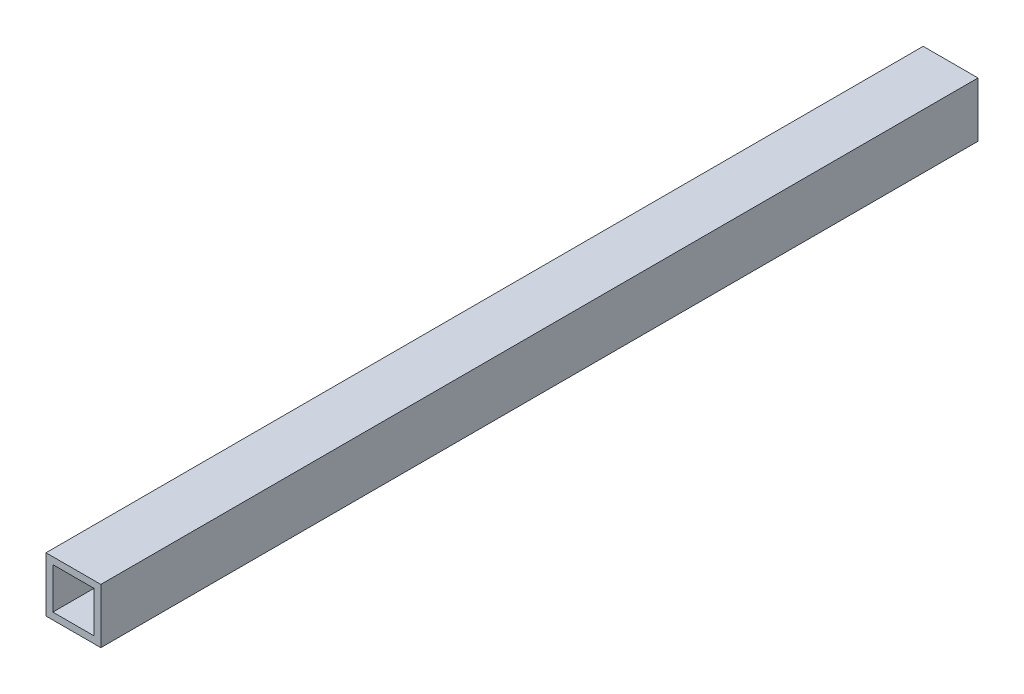
ISO-10303-21;
HEADER;
FILE_DESCRIPTION(('STEP AP214'),'2;1');
FILE_NAME('part.step','',(''),(''),'','','');
FILE_SCHEMA(('AUTOMOTIVE_DESIGN { 1 0 10303 214 1 1 1 1 }'));
ENDSEC;
DATA;
#1=APPLICATION_CONTEXT('core data for automotive mechanical design processes');
#2=APPLICATION_PROTOCOL_DEFINITION('international standard','automotive_design',2000,#1);
#3=PRODUCT_CONTEXT('',#1,'mechanical');
#4=PRODUCT('Part','Part','',(#3));
#5=PRODUCT_RELATED_PRODUCT_CATEGORY('part','',(#4));
#6=PRODUCT_DEFINITION_FORMATION('','',#4);
#7=PRODUCT_DEFINITION_CONTEXT('part definition',#1,'design');
#8=PRODUCT_DEFINITION('design','',#6,#7);
#9=PRODUCT_DEFINITION_SHAPE('','',#8);
#10=(LENGTH_UNIT() NAMED_UNIT(*) SI_UNIT(.MILLI.,.METRE.));
#11=(NAMED_UNIT(*) PLANE_ANGLE_UNIT() SI_UNIT($,.RADIAN.));
#12=(NAMED_UNIT(*) SI_UNIT($,.STERADIAN.) SOLID_ANGLE_UNIT());
#13=UNCERTAINTY_MEASURE_WITH_UNIT(LENGTH_MEASURE(1.E-05),#10,'distance_accuracy_value','');
#14=(GEOMETRIC_REPRESENTATION_CONTEXT(3) GLOBAL_UNCERTAINTY_ASSIGNED_CONTEXT((#13)) GLOBAL_UNIT_ASSIGNED_CONTEXT((#10,
#11,#12)) REPRESENTATION_CONTEXT('',''));
#15=CARTESIAN_POINT('',(0.,0.,0.));
#16=DIRECTION('',(0.,0.,1.));
#17=DIRECTION('',(1.,0.,0.));
#18=AXIS2_PLACEMENT_3D('',#15,#16,#17);
#19=CARTESIAN_POINT('',(0.,0.,406.4));
#20=DIRECTION('',(0.,0.,-1.));
#21=DIRECTION('',(-1.,0.,0.));
#22=AXIS2_PLACEMENT_3D('',#19,#20,#21);
#23=PLANE('',#22);
#24=DIRECTION('',(0.,1.,0.));
#25=VECTOR('',#24,1.);
#26=CARTESIAN_POINT('',(12.7,-12.7,406.4));
#27=LINE('',#26,#25);
#28=CARTESIAN_POINT('',(12.7,-12.7,406.4));
#29=VERTEX_POINT('',#28);
#30=CARTESIAN_POINT('',(12.7,12.7,406.4));
#31=VERTEX_POINT('',#30);
#32=EDGE_CURVE('E155',#29,#31,#27,.T.);
#33=ORIENTED_EDGE('',*,*,#32,.T.);
#34=DIRECTION('',(-1.,0.,0.));
#35=VECTOR('',#34,1.);
#36=CARTESIAN_POINT('',(-12.7,12.7,406.4));
#37=LINE('',#36,#35);
#38=CARTESIAN_POINT('',(-12.7,12.7,406.4));
#39=VERTEX_POINT('',#38);
#40=EDGE_CURVE('E158',#31,#39,#37,.T.);
#41=ORIENTED_EDGE('',*,*,#40,.T.);
#42=DIRECTION('',(0.,-1.,0.));
#43=VECTOR('',#42,1.);
#44=CARTESIAN_POINT('',(-12.7,-12.7,406.4));
#45=LINE('',#44,#43);
#46=CARTESIAN_POINT('',(-12.7,-12.7,406.4));
#47=VERTEX_POINT('',#46);
#48=EDGE_CURVE('E161',#39,#47,#45,.T.);
#49=ORIENTED_EDGE('',*,*,#48,.T.);
#50=DIRECTION('',(1.,0.,0.));
#51=VECTOR('',#50,1.);
#52=CARTESIAN_POINT('',(-12.7,-12.7,406.4));
#53=LINE('',#52,#51);
#54=EDGE_CURVE('E163',#47,#29,#53,.T.);
#55=ORIENTED_EDGE('',*,*,#54,.T.);
#56=EDGE_LOOP('',(#33,#41,#49,#55));
#57=FACE_BOUND('',#56,.T.);
#58=DIRECTION('',(0.,-1.,0.));
#59=VECTOR('',#58,1.);
#60=CARTESIAN_POINT('',(-9.525,-9.525,406.4));
#61=LINE('',#60,#59);
#62=CARTESIAN_POINT('',(-9.525,9.525,406.4));
#63=VERTEX_POINT('',#62);
#64=CARTESIAN_POINT('',(-9.525,-9.525,406.4));
#65=VERTEX_POINT('',#64);
#66=EDGE_CURVE('E111',#63,#65,#61,.T.);
#67=ORIENTED_EDGE('',*,*,#66,.F.);
#68=DIRECTION('',(-1.,0.,0.));
#69=VECTOR('',#68,1.);
#70=CARTESIAN_POINT('',(-9.525,9.525,406.4));
#71=LINE('',#70,#69);
#72=CARTESIAN_POINT('',(9.525,9.525,406.4));
#73=VERTEX_POINT('',#72);
#74=EDGE_CURVE('E134',#73,#63,#71,.T.);
#75=ORIENTED_EDGE('',*,*,#74,.F.);
#76=DIRECTION('',(0.,1.,0.));
#77=VECTOR('',#76,1.);
#78=CARTESIAN_POINT('',(9.525,-9.525,406.4));
#79=LINE('',#78,#77);
#80=CARTESIAN_POINT('',(9.525,-9.525,406.4));
#81=VERTEX_POINT('',#80);
#82=EDGE_CURVE('E132',#81,#73,#79,.T.);
#83=ORIENTED_EDGE('',*,*,#82,.F.);
#84=DIRECTION('',(1.,0.,0.));
#85=VECTOR('',#84,1.);
#86=CARTESIAN_POINT('',(-9.525,-9.525,406.4));
#87=LINE('',#86,#85);
#88=EDGE_CURVE('E119',#65,#81,#87,.T.);
#89=ORIENTED_EDGE('',*,*,#88,.F.);
#90=EDGE_LOOP('',(#67,#75,#83,#89));
#91=FACE_BOUND('',#90,.T.);
#92=ADVANCED_FACE('F38',(#57,#91),#23,.F.);
#93=CARTESIAN_POINT('',(0.,0.,0.));
#94=DIRECTION('',(0.,0.,-1.));
#95=DIRECTION('',(-1.,0.,0.));
#96=AXIS2_PLACEMENT_3D('',#93,#94,#95);
#97=PLANE('',#96);
#98=DIRECTION('',(0.,1.,0.));
#99=VECTOR('',#98,1.);
#100=CARTESIAN_POINT('',(12.7,-12.7,0.));
#101=LINE('',#100,#99);
#102=CARTESIAN_POINT('',(12.7,-12.7,0.));
#103=VERTEX_POINT('',#102);
#104=CARTESIAN_POINT('',(12.7,12.7,0.));
#105=VERTEX_POINT('',#104);
#106=EDGE_CURVE('E128',#103,#105,#101,.T.);
#107=ORIENTED_EDGE('',*,*,#106,.F.);
#108=DIRECTION('',(1.,0.,0.));
#109=VECTOR('',#108,1.);
#110=CARTESIAN_POINT('',(-12.7,-12.7,0.));
#111=LINE('',#110,#109);
#112=CARTESIAN_POINT('',(-12.7,-12.7,0.));
#113=VERTEX_POINT('',#112);
#114=EDGE_CURVE('E159',#113,#103,#111,.T.);
#115=ORIENTED_EDGE('',*,*,#114,.F.);
#116=DIRECTION('',(0.,-1.,0.));
#117=VECTOR('',#116,1.);
#118=CARTESIAN_POINT('',(-12.7,-12.7,0.));
#119=LINE('',#118,#117);
#120=CARTESIAN_POINT('',(-12.7,12.7,0.));
#121=VERTEX_POINT('',#120);
#122=EDGE_CURVE('E172',#121,#113,#119,.T.);
#123=ORIENTED_EDGE('',*,*,#122,.F.);
#124=DIRECTION('',(-1.,0.,0.));
#125=VECTOR('',#124,1.);
#126=CARTESIAN_POINT('',(-12.7,12.7,0.));
#127=LINE('',#126,#125);
#128=EDGE_CURVE('E169',#105,#121,#127,.T.);
#129=ORIENTED_EDGE('',*,*,#128,.F.);
#130=EDGE_LOOP('',(#107,#115,#123,#129));
#131=FACE_BOUND('',#130,.T.);
#132=DIRECTION('',(-1.,0.,0.));
#133=VECTOR('',#132,1.);
#134=CARTESIAN_POINT('',(-9.525,9.525,0.));
#135=LINE('',#134,#133);
#136=CARTESIAN_POINT('',(9.525,9.525,0.));
#137=VERTEX_POINT('',#136);
#138=CARTESIAN_POINT('',(-9.525,9.525,0.));
#139=VERTEX_POINT('',#138);
#140=EDGE_CURVE('E120',#137,#139,#135,.T.);
#141=ORIENTED_EDGE('',*,*,#140,.T.);
#142=DIRECTION('',(0.,-1.,0.));
#143=VECTOR('',#142,1.);
#144=CARTESIAN_POINT('',(-9.525,-9.525,0.));
#145=LINE('',#144,#143);
#146=CARTESIAN_POINT('',(-9.525,-9.525,0.));
#147=VERTEX_POINT('',#146);
#148=EDGE_CURVE('E65',#139,#147,#145,.T.);
#149=ORIENTED_EDGE('',*,*,#148,.T.);
#150=DIRECTION('',(1.,0.,0.));
#151=VECTOR('',#150,1.);
#152=CARTESIAN_POINT('',(-9.525,-9.525,0.));
#153=LINE('',#152,#151);
#154=CARTESIAN_POINT('',(9.525,-9.525,0.));
#155=VERTEX_POINT('',#154);
#156=EDGE_CURVE('E126',#147,#155,#153,.T.);
#157=ORIENTED_EDGE('',*,*,#156,.T.);
#158=DIRECTION('',(0.,1.,0.));
#159=VECTOR('',#158,1.);
#160=CARTESIAN_POINT('',(9.525,-9.525,0.));
#161=LINE('',#160,#159);
#162=EDGE_CURVE('E142',#155,#137,#161,.T.);
#163=ORIENTED_EDGE('',*,*,#162,.T.);
#164=EDGE_LOOP('',(#141,#149,#157,#163));
#165=FACE_BOUND('',#164,.T.);
#166=ADVANCED_FACE('F195',(#131,#165),#97,.T.);
#167=CARTESIAN_POINT('',(12.7,-12.7,406.4));
#168=DIRECTION('',(-1.,0.,0.));
#169=DIRECTION('',(0.,0.,1.));
#170=AXIS2_PLACEMENT_3D('',#167,#168,#169);
#171=PLANE('',#170);
#172=ORIENTED_EDGE('',*,*,#106,.T.);
#173=DIRECTION('',(0.,0.,-1.));
#174=VECTOR('',#173,1.);
#175=CARTESIAN_POINT('',(12.7,12.7,406.4));
#176=LINE('',#175,#174);
#177=EDGE_CURVE('E11',#31,#105,#176,.T.);
#178=ORIENTED_EDGE('',*,*,#177,.F.);
#179=ORIENTED_EDGE('',*,*,#32,.F.);
#180=DIRECTION('',(0.,0.,-1.));
#181=VECTOR('',#180,1.);
#182=CARTESIAN_POINT('',(12.7,-12.7,406.4));
#183=LINE('',#182,#181);
#184=EDGE_CURVE('E165',#29,#103,#183,.T.);
#185=ORIENTED_EDGE('',*,*,#184,.T.);
#186=EDGE_LOOP('',(#172,#178,#179,#185));
#187=FACE_BOUND('',#186,.T.);
#188=ADVANCED_FACE('F40',(#187),#171,.F.);
#189=CARTESIAN_POINT('',(-12.7,12.7,406.4));
#190=DIRECTION('',(0.,-1.,0.));
#191=DIRECTION('',(0.,0.,-1.));
#192=AXIS2_PLACEMENT_3D('',#189,#190,#191);
#193=PLANE('',#192);
#194=ORIENTED_EDGE('',*,*,#128,.T.);
#195=DIRECTION('',(0.,0.,-1.));
#196=VECTOR('',#195,1.);
#197=CARTESIAN_POINT('',(-12.7,12.7,406.4));
#198=LINE('',#197,#196);
#199=EDGE_CURVE('E47',#39,#121,#198,.T.);
#200=ORIENTED_EDGE('',*,*,#199,.F.);
#201=ORIENTED_EDGE('',*,*,#40,.F.);
#202=ORIENTED_EDGE('',*,*,#177,.T.);
#203=EDGE_LOOP('',(#194,#200,#201,#202));
#204=FACE_BOUND('',#203,.T.);
#205=ADVANCED_FACE('F205',(#204),#193,.F.);
#206=CARTESIAN_POINT('',(-12.7,-12.7,406.4));
#207=DIRECTION('',(1.,0.,0.));
#208=DIRECTION('',(0.,0.,-1.));
#209=AXIS2_PLACEMENT_3D('',#206,#207,#208);
#210=PLANE('',#209);
#211=ORIENTED_EDGE('',*,*,#122,.T.);
#212=DIRECTION('',(0.,0.,-1.));
#213=VECTOR('',#212,1.);
#214=CARTESIAN_POINT('',(-12.7,-12.7,406.4));
#215=LINE('',#214,#213);
#216=EDGE_CURVE('E180',#47,#113,#215,.T.);
#217=ORIENTED_EDGE('',*,*,#216,.F.);
#218=ORIENTED_EDGE('',*,*,#48,.F.);
#219=ORIENTED_EDGE('',*,*,#199,.T.);
#220=EDGE_LOOP('',(#211,#217,#218,#219));
#221=FACE_BOUND('',#220,.T.);
#222=ADVANCED_FACE('F189',(#221),#210,.F.);
#223=CARTESIAN_POINT('',(-12.7,-12.7,406.4));
#224=DIRECTION('',(0.,1.,0.));
#225=DIRECTION('',(0.,0.,1.));
#226=AXIS2_PLACEMENT_3D('',#223,#224,#225);
#227=PLANE('',#226);
#228=ORIENTED_EDGE('',*,*,#114,.T.);
#229=ORIENTED_EDGE('',*,*,#184,.F.);
#230=ORIENTED_EDGE('',*,*,#54,.F.);
#231=ORIENTED_EDGE('',*,*,#216,.T.);
#232=EDGE_LOOP('',(#228,#229,#230,#231));
#233=FACE_BOUND('',#232,.T.);
#234=ADVANCED_FACE('F199',(#233),#227,.F.);
#235=CARTESIAN_POINT('',(-9.525,-9.525,406.4));
#236=DIRECTION('',(1.,0.,0.));
#237=DIRECTION('',(0.,0.,-1.));
#238=AXIS2_PLACEMENT_3D('',#235,#236,#237);
#239=PLANE('',#238);
#240=ORIENTED_EDGE('',*,*,#148,.F.);
#241=DIRECTION('',(0.,0.,-1.));
#242=VECTOR('',#241,1.);
#243=CARTESIAN_POINT('',(-9.525,9.525,406.4));
#244=LINE('',#243,#242);
#245=EDGE_CURVE('E115',#63,#139,#244,.T.);
#246=ORIENTED_EDGE('',*,*,#245,.F.);
#247=ORIENTED_EDGE('',*,*,#66,.T.);
#248=DIRECTION('',(0.,0.,-1.));
#249=VECTOR('',#248,1.);
#250=CARTESIAN_POINT('',(-9.525,-9.525,406.4));
#251=LINE('',#250,#249);
#252=EDGE_CURVE('E114',#65,#147,#251,.T.);
#253=ORIENTED_EDGE('',*,*,#252,.T.);
#254=EDGE_LOOP('',(#240,#246,#247,#253));
#255=FACE_BOUND('',#254,.T.);
#256=ADVANCED_FACE('F113',(#255),#239,.T.);
#257=CARTESIAN_POINT('',(-9.525,-9.525,406.4));
#258=DIRECTION('',(0.,1.,0.));
#259=DIRECTION('',(0.,0.,1.));
#260=AXIS2_PLACEMENT_3D('',#257,#258,#259);
#261=PLANE('',#260);
#262=ORIENTED_EDGE('',*,*,#156,.F.);
#263=ORIENTED_EDGE('',*,*,#252,.F.);
#264=ORIENTED_EDGE('',*,*,#88,.T.);
#265=DIRECTION('',(0.,0.,-1.));
#266=VECTOR('',#265,1.);
#267=CARTESIAN_POINT('',(9.525,-9.525,406.4));
#268=LINE('',#267,#266);
#269=EDGE_CURVE('E129',#81,#155,#268,.T.);
#270=ORIENTED_EDGE('',*,*,#269,.T.);
#271=EDGE_LOOP('',(#262,#263,#264,#270));
#272=FACE_BOUND('',#271,.T.);
#273=ADVANCED_FACE('F123',(#272),#261,.T.);
#274=CARTESIAN_POINT('',(9.525,-9.525,406.4));
#275=DIRECTION('',(-1.,0.,0.));
#276=DIRECTION('',(0.,0.,1.));
#277=AXIS2_PLACEMENT_3D('',#274,#275,#276);
#278=PLANE('',#277);
#279=ORIENTED_EDGE('',*,*,#162,.F.);
#280=ORIENTED_EDGE('',*,*,#269,.F.);
#281=ORIENTED_EDGE('',*,*,#82,.T.);
#282=DIRECTION('',(0.,0.,-1.));
#283=VECTOR('',#282,1.);
#284=CARTESIAN_POINT('',(9.525,9.525,406.4));
#285=LINE('',#284,#283);
#286=EDGE_CURVE('E54',#73,#137,#285,.T.);
#287=ORIENTED_EDGE('',*,*,#286,.T.);
#288=EDGE_LOOP('',(#279,#280,#281,#287));
#289=FACE_BOUND('',#288,.T.);
#290=ADVANCED_FACE('F228',(#289),#278,.T.);
#291=CARTESIAN_POINT('',(-9.525,9.525,406.4));
#292=DIRECTION('',(0.,-1.,0.));
#293=DIRECTION('',(0.,0.,-1.));
#294=AXIS2_PLACEMENT_3D('',#291,#292,#293);
#295=PLANE('',#294);
#296=ORIENTED_EDGE('',*,*,#140,.F.);
#297=ORIENTED_EDGE('',*,*,#286,.F.);
#298=ORIENTED_EDGE('',*,*,#74,.T.);
#299=ORIENTED_EDGE('',*,*,#245,.T.);
#300=EDGE_LOOP('',(#296,#297,#298,#299));
#301=FACE_BOUND('',#300,.T.);
#302=ADVANCED_FACE('F232',(#301),#295,.T.);
#303=CLOSED_SHELL('',(#92,#166,#188,#205,#222,#234,#256,#273,#290,#302));
#304=MANIFOLD_SOLID_BREP('B2',#303);
#305=ADVANCED_BREP_SHAPE_REPRESENTATION('',(#18,#304),#14);
#306=SHAPE_DEFINITION_REPRESENTATION(#9,#305);
ENDSEC;
END-ISO-10303-21;
